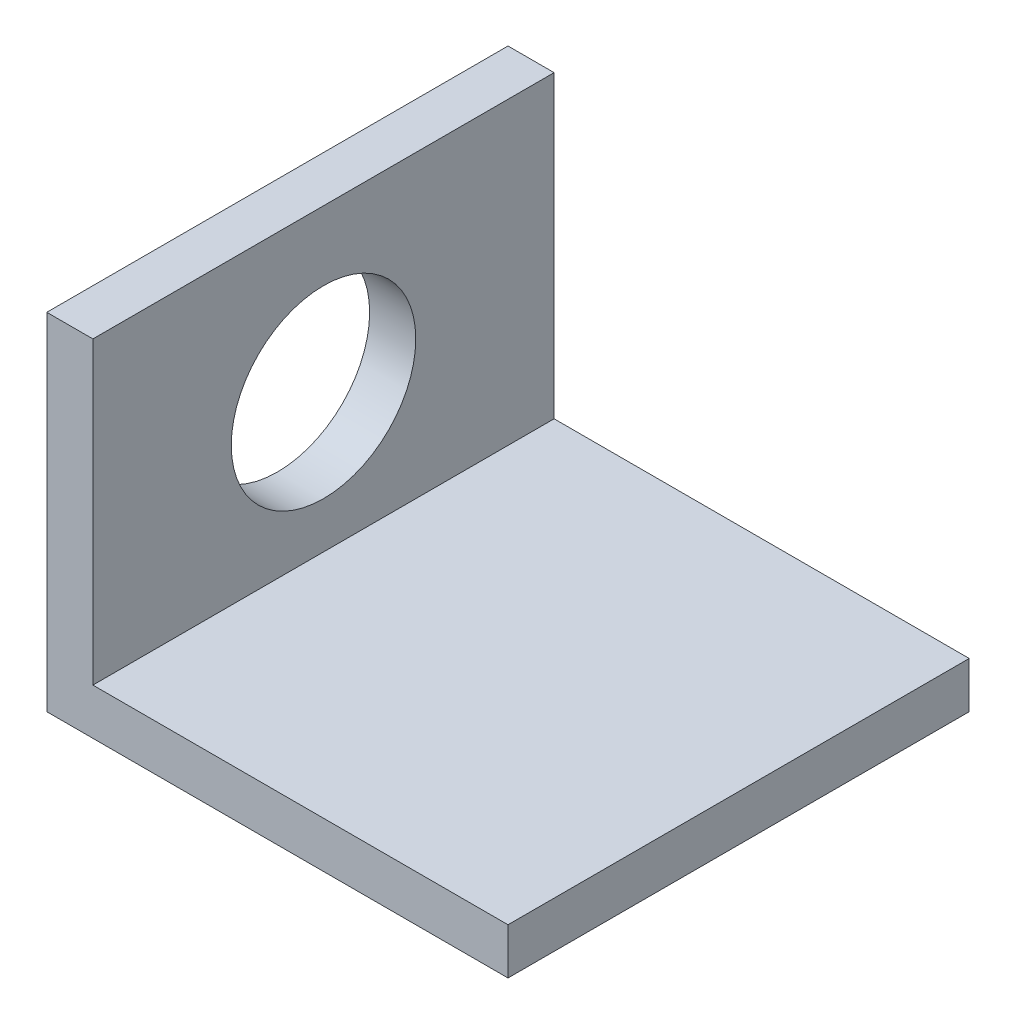
ISO-10303-21;
HEADER;
FILE_DESCRIPTION(('STEP AP214'),'2;1');
FILE_NAME('part.step','',(''),(''),'','','');
FILE_SCHEMA(('AUTOMOTIVE_DESIGN { 1 0 10303 214 1 1 1 1 }'));
ENDSEC;
DATA;
#1=APPLICATION_CONTEXT('core data for automotive mechanical design processes');
#2=APPLICATION_PROTOCOL_DEFINITION('international standard','automotive_design',2000,#1);
#3=PRODUCT_CONTEXT('',#1,'mechanical');
#4=PRODUCT('Part','Part','',(#3));
#5=PRODUCT_RELATED_PRODUCT_CATEGORY('part','',(#4));
#6=PRODUCT_DEFINITION_FORMATION('','',#4);
#7=PRODUCT_DEFINITION_CONTEXT('part definition',#1,'design');
#8=PRODUCT_DEFINITION('design','',#6,#7);
#9=PRODUCT_DEFINITION_SHAPE('','',#8);
#10=(LENGTH_UNIT() NAMED_UNIT(*) SI_UNIT(.MILLI.,.METRE.));
#11=(NAMED_UNIT(*) PLANE_ANGLE_UNIT() SI_UNIT($,.RADIAN.));
#12=(NAMED_UNIT(*) SI_UNIT($,.STERADIAN.) SOLID_ANGLE_UNIT());
#13=UNCERTAINTY_MEASURE_WITH_UNIT(LENGTH_MEASURE(1.E-05),#10,'distance_accuracy_value','');
#14=(GEOMETRIC_REPRESENTATION_CONTEXT(3) GLOBAL_UNCERTAINTY_ASSIGNED_CONTEXT((#13)) GLOBAL_UNIT_ASSIGNED_CONTEXT((#10,
#11,#12)) REPRESENTATION_CONTEXT('',''));
#15=CARTESIAN_POINT('',(0.,0.,0.));
#16=DIRECTION('',(0.,0.,1.));
#17=DIRECTION('',(1.,0.,0.));
#18=AXIS2_PLACEMENT_3D('',#15,#16,#17);
#19=CARTESIAN_POINT('',(9.,0.,10.));
#20=DIRECTION('',(0.,-1.,0.));
#21=DIRECTION('',(1.,0.,0.));
#22=AXIS2_PLACEMENT_3D('',#19,#20,#21);
#23=PLANE('',#22);
#24=DIRECTION('',(-1.,0.,0.));
#25=VECTOR('',#24,1.);
#26=CARTESIAN_POINT('',(9.,0.,0.));
#27=LINE('',#26,#25);
#28=CARTESIAN_POINT('',(9.,0.,0.));
#29=VERTEX_POINT('',#28);
#30=CARTESIAN_POINT('',(0.,0.,0.));
#31=VERTEX_POINT('',#30);
#32=EDGE_CURVE('E120',#29,#31,#27,.T.);
#33=ORIENTED_EDGE('',*,*,#32,.T.);
#34=DIRECTION('',(0.,0.,-1.));
#35=VECTOR('',#34,1.);
#36=CARTESIAN_POINT('',(0.,0.,10.));
#37=LINE('',#36,#35);
#38=CARTESIAN_POINT('',(0.,0.,10.));
#39=VERTEX_POINT('',#38);
#40=EDGE_CURVE('E11',#39,#31,#37,.T.);
#41=ORIENTED_EDGE('',*,*,#40,.F.);
#42=DIRECTION('',(-1.,0.,0.));
#43=VECTOR('',#42,1.);
#44=CARTESIAN_POINT('',(9.,0.,10.));
#45=LINE('',#44,#43);
#46=CARTESIAN_POINT('',(9.,0.,10.));
#47=VERTEX_POINT('',#46);
#48=EDGE_CURVE('E131',#47,#39,#45,.T.);
#49=ORIENTED_EDGE('',*,*,#48,.F.);
#50=DIRECTION('',(0.,0.,-1.));
#51=VECTOR('',#50,1.);
#52=CARTESIAN_POINT('',(9.,0.,10.));
#53=LINE('',#52,#51);
#54=EDGE_CURVE('E116',#47,#29,#53,.T.);
#55=ORIENTED_EDGE('',*,*,#54,.T.);
#56=EDGE_LOOP('',(#33,#41,#49,#55));
#57=FACE_BOUND('',#56,.T.);
#58=ADVANCED_FACE('F36',(#57),#23,.F.);
#59=CARTESIAN_POINT('',(0.,0.,10.));
#60=DIRECTION('',(-1.,0.,0.));
#61=DIRECTION('',(0.,-1.,0.));
#62=AXIS2_PLACEMENT_3D('',#59,#60,#61);
#63=PLANE('',#62);
#64=CARTESIAN_POINT('',(0.,3.,5.));
#65=DIRECTION('',(-1.,0.,0.));
#66=DIRECTION('',(0.,-1.,0.));
#67=AXIS2_PLACEMENT_3D('',#64,#65,#66);
#68=CIRCLE('',#67,2.);
#69=CARTESIAN_POINT('',(0.,1.,5.));
#70=VERTEX_POINT('',#69);
#71=EDGE_CURVE('E124',#70,#70,#68,.T.);
#72=ORIENTED_EDGE('',*,*,#71,.T.);
#73=EDGE_LOOP('',(#72));
#74=FACE_BOUND('',#73,.T.);
#75=DIRECTION('',(0.,1.,0.));
#76=VECTOR('',#75,1.);
#77=CARTESIAN_POINT('',(0.,0.,0.));
#78=LINE('',#77,#76);
#79=CARTESIAN_POINT('',(0.,6.5,0.));
#80=VERTEX_POINT('',#79);
#81=EDGE_CURVE('E123',#31,#80,#78,.T.);
#82=ORIENTED_EDGE('',*,*,#81,.T.);
#83=DIRECTION('',(0.,0.,-1.));
#84=VECTOR('',#83,1.);
#85=CARTESIAN_POINT('',(0.,6.5,10.));
#86=LINE('',#85,#84);
#87=CARTESIAN_POINT('',(0.,6.5,10.));
#88=VERTEX_POINT('',#87);
#89=EDGE_CURVE('E44',#88,#80,#86,.T.);
#90=ORIENTED_EDGE('',*,*,#89,.F.);
#91=DIRECTION('',(0.,1.,0.));
#92=VECTOR('',#91,1.);
#93=CARTESIAN_POINT('',(0.,0.,10.));
#94=LINE('',#93,#92);
#95=EDGE_CURVE('E89',#39,#88,#94,.T.);
#96=ORIENTED_EDGE('',*,*,#95,.F.);
#97=ORIENTED_EDGE('',*,*,#40,.T.);
#98=EDGE_LOOP('',(#82,#90,#96,#97));
#99=FACE_BOUND('',#98,.T.);
#100=ADVANCED_FACE('F155',(#74,#99),#63,.F.);
#101=CARTESIAN_POINT('',(0.,6.5,10.));
#102=DIRECTION('',(0.,-1.,0.));
#103=DIRECTION('',(0.,0.,-1.));
#104=AXIS2_PLACEMENT_3D('',#101,#102,#103);
#105=PLANE('',#104);
#106=DIRECTION('',(-1.,0.,0.));
#107=VECTOR('',#106,1.);
#108=CARTESIAN_POINT('',(0.,6.5,0.));
#109=LINE('',#108,#107);
#110=CARTESIAN_POINT('',(-0.999999999999999,6.5,0.));
#111=VERTEX_POINT('',#110);
#112=EDGE_CURVE('E126',#80,#111,#109,.T.);
#113=ORIENTED_EDGE('',*,*,#112,.T.);
#114=DIRECTION('',(0.,0.,-1.));
#115=VECTOR('',#114,1.);
#116=CARTESIAN_POINT('',(-0.999999999999999,6.5,10.));
#117=LINE('',#116,#115);
#118=CARTESIAN_POINT('',(-0.999999999999999,6.5,10.));
#119=VERTEX_POINT('',#118);
#120=EDGE_CURVE('E111',#119,#111,#117,.T.);
#121=ORIENTED_EDGE('',*,*,#120,.F.);
#122=DIRECTION('',(-1.,0.,0.));
#123=VECTOR('',#122,1.);
#124=CARTESIAN_POINT('',(0.,6.5,10.));
#125=LINE('',#124,#123);
#126=EDGE_CURVE('E102',#88,#119,#125,.T.);
#127=ORIENTED_EDGE('',*,*,#126,.F.);
#128=ORIENTED_EDGE('',*,*,#89,.T.);
#129=EDGE_LOOP('',(#113,#121,#127,#128));
#130=FACE_BOUND('',#129,.T.);
#131=ADVANCED_FACE('F137',(#130),#105,.F.);
#132=CARTESIAN_POINT('',(-0.999999999999999,6.5,10.));
#133=DIRECTION('',(1.,0.,0.));
#134=DIRECTION('',(0.,1.,0.));
#135=AXIS2_PLACEMENT_3D('',#132,#133,#134);
#136=PLANE('',#135);
#137=CARTESIAN_POINT('',(-1.,3.,5.));
#138=DIRECTION('',(-1.,0.,0.));
#139=DIRECTION('',(0.,-1.,0.));
#140=AXIS2_PLACEMENT_3D('',#137,#138,#139);
#141=CIRCLE('',#140,2.);
#142=CARTESIAN_POINT('',(-1.,1.,5.));
#143=VERTEX_POINT('',#142);
#144=EDGE_CURVE('E172',#143,#143,#141,.T.);
#145=ORIENTED_EDGE('',*,*,#144,.F.);
#146=EDGE_LOOP('',(#145));
#147=FACE_BOUND('',#146,.T.);
#148=DIRECTION('',(0.,-1.,0.));
#149=VECTOR('',#148,1.);
#150=CARTESIAN_POINT('',(-0.999999999999999,6.5,0.));
#151=LINE('',#150,#149);
#152=CARTESIAN_POINT('',(-1.,-0.999999999999999,0.));
#153=VERTEX_POINT('',#152);
#154=EDGE_CURVE('E110',#111,#153,#151,.T.);
#155=ORIENTED_EDGE('',*,*,#154,.T.);
#156=DIRECTION('',(0.,0.,-1.));
#157=VECTOR('',#156,1.);
#158=CARTESIAN_POINT('',(-1.,-0.999999999999999,10.));
#159=LINE('',#158,#157);
#160=CARTESIAN_POINT('',(-1.,-0.999999999999999,10.));
#161=VERTEX_POINT('',#160);
#162=EDGE_CURVE('E107',#161,#153,#159,.T.);
#163=ORIENTED_EDGE('',*,*,#162,.F.);
#164=DIRECTION('',(0.,-1.,0.));
#165=VECTOR('',#164,1.);
#166=CARTESIAN_POINT('',(-0.999999999999999,6.5,10.));
#167=LINE('',#166,#165);
#168=EDGE_CURVE('E96',#119,#161,#167,.T.);
#169=ORIENTED_EDGE('',*,*,#168,.F.);
#170=ORIENTED_EDGE('',*,*,#120,.T.);
#171=EDGE_LOOP('',(#155,#163,#169,#170));
#172=FACE_BOUND('',#171,.T.);
#173=ADVANCED_FACE('F108',(#147,#172),#136,.F.);
#174=CARTESIAN_POINT('',(-1.,-0.999999999999999,10.));
#175=DIRECTION('',(0.,1.,0.));
#176=DIRECTION('',(-1.,0.,0.));
#177=AXIS2_PLACEMENT_3D('',#174,#175,#176);
#178=PLANE('',#177);
#179=DIRECTION('',(1.,0.,0.));
#180=VECTOR('',#179,1.);
#181=CARTESIAN_POINT('',(-1.,-0.999999999999999,0.));
#182=LINE('',#181,#180);
#183=CARTESIAN_POINT('',(9.,-0.999999999999999,0.));
#184=VERTEX_POINT('',#183);
#185=EDGE_CURVE('E75',#153,#184,#182,.T.);
#186=ORIENTED_EDGE('',*,*,#185,.T.);
#187=DIRECTION('',(0.,0.,-1.));
#188=VECTOR('',#187,1.);
#189=CARTESIAN_POINT('',(9.,-0.999999999999999,10.));
#190=LINE('',#189,#188);
#191=CARTESIAN_POINT('',(9.,-0.999999999999999,10.));
#192=VERTEX_POINT('',#191);
#193=EDGE_CURVE('E112',#192,#184,#190,.T.);
#194=ORIENTED_EDGE('',*,*,#193,.F.);
#195=DIRECTION('',(1.,0.,0.));
#196=VECTOR('',#195,1.);
#197=CARTESIAN_POINT('',(-1.,-0.999999999999999,10.));
#198=LINE('',#197,#196);
#199=EDGE_CURVE('E100',#161,#192,#198,.T.);
#200=ORIENTED_EDGE('',*,*,#199,.F.);
#201=ORIENTED_EDGE('',*,*,#162,.T.);
#202=EDGE_LOOP('',(#186,#194,#200,#201));
#203=FACE_BOUND('',#202,.T.);
#204=ADVANCED_FACE('F114',(#203),#178,.F.);
#205=CARTESIAN_POINT('',(9.,-0.999999999999999,10.));
#206=DIRECTION('',(-1.,0.,0.));
#207=DIRECTION('',(0.,-1.,0.));
#208=AXIS2_PLACEMENT_3D('',#205,#206,#207);
#209=PLANE('',#208);
#210=DIRECTION('',(0.,1.,0.));
#211=VECTOR('',#210,1.);
#212=CARTESIAN_POINT('',(9.,-0.999999999999999,0.));
#213=LINE('',#212,#211);
#214=EDGE_CURVE('E81',#184,#29,#213,.T.);
#215=ORIENTED_EDGE('',*,*,#214,.T.);
#216=ORIENTED_EDGE('',*,*,#54,.F.);
#217=DIRECTION('',(0.,1.,0.));
#218=VECTOR('',#217,1.);
#219=CARTESIAN_POINT('',(9.,-0.999999999999999,10.));
#220=LINE('',#219,#218);
#221=EDGE_CURVE('E52',#192,#47,#220,.T.);
#222=ORIENTED_EDGE('',*,*,#221,.F.);
#223=ORIENTED_EDGE('',*,*,#193,.T.);
#224=EDGE_LOOP('',(#215,#216,#222,#223));
#225=FACE_BOUND('',#224,.T.);
#226=ADVANCED_FACE('F144',(#225),#209,.F.);
#227=CARTESIAN_POINT('',(0.,0.,10.));
#228=DIRECTION('',(0.,0.,-1.));
#229=DIRECTION('',(-1.,0.,0.));
#230=AXIS2_PLACEMENT_3D('',#227,#228,#229);
#231=PLANE('',#230);
#232=ORIENTED_EDGE('',*,*,#48,.T.);
#233=ORIENTED_EDGE('',*,*,#95,.T.);
#234=ORIENTED_EDGE('',*,*,#126,.T.);
#235=ORIENTED_EDGE('',*,*,#168,.T.);
#236=ORIENTED_EDGE('',*,*,#199,.T.);
#237=ORIENTED_EDGE('',*,*,#221,.T.);
#238=EDGE_LOOP('',(#232,#233,#234,#235,#236,#237));
#239=FACE_BOUND('',#238,.T.);
#240=ADVANCED_FACE('F98',(#239),#231,.F.);
#241=CARTESIAN_POINT('',(0.,0.,0.));
#242=DIRECTION('',(0.,0.,-1.));
#243=DIRECTION('',(-1.,0.,0.));
#244=AXIS2_PLACEMENT_3D('',#241,#242,#243);
#245=PLANE('',#244);
#246=ORIENTED_EDGE('',*,*,#32,.F.);
#247=ORIENTED_EDGE('',*,*,#214,.F.);
#248=ORIENTED_EDGE('',*,*,#185,.F.);
#249=ORIENTED_EDGE('',*,*,#154,.F.);
#250=ORIENTED_EDGE('',*,*,#112,.F.);
#251=ORIENTED_EDGE('',*,*,#81,.F.);
#252=EDGE_LOOP('',(#246,#247,#248,#249,#250,#251));
#253=FACE_BOUND('',#252,.T.);
#254=ADVANCED_FACE('F140',(#253),#245,.T.);
#255=CARTESIAN_POINT('',(9.,3.,5.));
#256=DIRECTION('',(-1.,0.,0.));
#257=DIRECTION('',(0.,-1.,0.));
#258=AXIS2_PLACEMENT_3D('',#255,#256,#257);
#259=CYLINDRICAL_SURFACE('',#258,2.);
#260=ORIENTED_EDGE('',*,*,#144,.T.);
#261=EDGE_LOOP('',(#260));
#262=FACE_BOUND('',#261,.T.);
#263=ORIENTED_EDGE('',*,*,#71,.F.);
#264=EDGE_LOOP('',(#263));
#265=FACE_BOUND('',#264,.T.);
#266=ADVANCED_FACE('F180',(#262,#265),#259,.F.);
#267=CLOSED_SHELL('',(#58,#100,#131,#173,#204,#226,#240,#254,#266));
#268=MANIFOLD_SOLID_BREP('B2',#267);
#269=ADVANCED_BREP_SHAPE_REPRESENTATION('',(#18,#268),#14);
#270=SHAPE_DEFINITION_REPRESENTATION(#9,#269);
ENDSEC;
END-ISO-10303-21;
